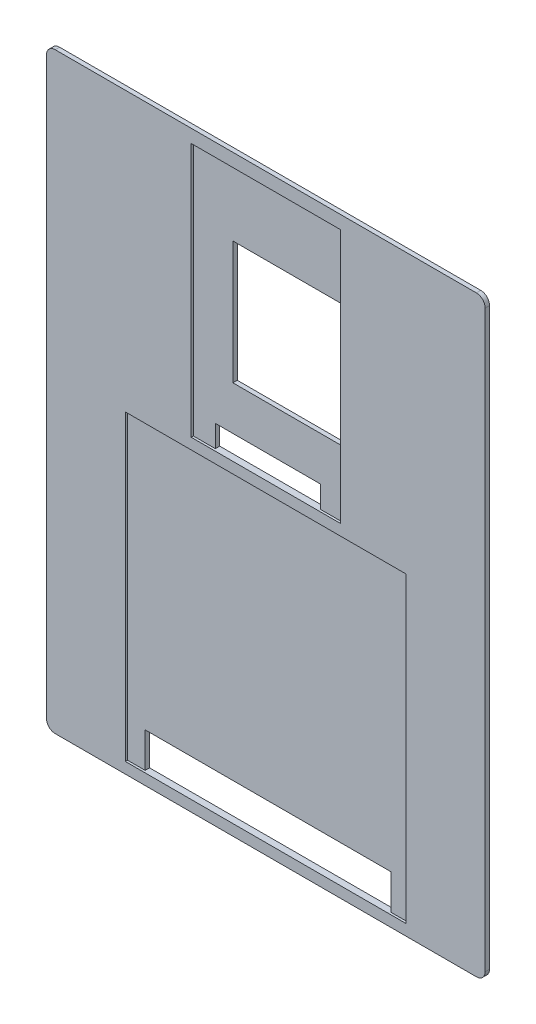
ISO-10303-21;
HEADER;
FILE_DESCRIPTION(('STEP AP214'),'2;1');
FILE_NAME('part.step','',(''),(''),'','','');
FILE_SCHEMA(('AUTOMOTIVE_DESIGN { 1 0 10303 214 1 1 1 1 }'));
ENDSEC;
DATA;
#1=APPLICATION_CONTEXT('core data for automotive mechanical design processes');
#2=APPLICATION_PROTOCOL_DEFINITION('international standard','automotive_design',2000,#1);
#3=PRODUCT_CONTEXT('',#1,'mechanical');
#4=PRODUCT('Part','Part','',(#3));
#5=PRODUCT_RELATED_PRODUCT_CATEGORY('part','',(#4));
#6=PRODUCT_DEFINITION_FORMATION('','',#4);
#7=PRODUCT_DEFINITION_CONTEXT('part definition',#1,'design');
#8=PRODUCT_DEFINITION('design','',#6,#7);
#9=PRODUCT_DEFINITION_SHAPE('','',#8);
#10=(LENGTH_UNIT() NAMED_UNIT(*) SI_UNIT(.MILLI.,.METRE.));
#11=(NAMED_UNIT(*) PLANE_ANGLE_UNIT() SI_UNIT($,.RADIAN.));
#12=(NAMED_UNIT(*) SI_UNIT($,.STERADIAN.) SOLID_ANGLE_UNIT());
#13=UNCERTAINTY_MEASURE_WITH_UNIT(LENGTH_MEASURE(1.E-05),#10,'distance_accuracy_value','');
#14=(GEOMETRIC_REPRESENTATION_CONTEXT(3) GLOBAL_UNCERTAINTY_ASSIGNED_CONTEXT((#13)) GLOBAL_UNIT_ASSIGNED_CONTEXT((#10,
#11,#12)) REPRESENTATION_CONTEXT('',''));
#15=CARTESIAN_POINT('',(0.,0.,0.));
#16=DIRECTION('',(0.,0.,1.));
#17=DIRECTION('',(1.,0.,0.));
#18=AXIS2_PLACEMENT_3D('',#15,#16,#17);
#19=CARTESIAN_POINT('',(-50.,0.,1.5));
#20=DIRECTION('',(1.,0.,0.));
#21=DIRECTION('',(0.,1.,0.));
#22=AXIS2_PLACEMENT_3D('',#19,#20,#21);
#23=PLANE('',#22);
#24=DIRECTION('',(0.,1.,0.));
#25=VECTOR('',#24,1.);
#26=CARTESIAN_POINT('',(-50.,0.,0.5));
#27=LINE('',#26,#25);
#28=CARTESIAN_POINT('',(-50.,-65.5,0.5));
#29=VERTEX_POINT('',#28);
#30=CARTESIAN_POINT('',(-50.,65.5,0.5));
#31=VERTEX_POINT('',#30);
#32=EDGE_CURVE('E269',#29,#31,#27,.T.);
#33=ORIENTED_EDGE('',*,*,#32,.F.);
#34=DIRECTION('',(0.,0.,-1.));
#35=VECTOR('',#34,1.);
#36=CARTESIAN_POINT('',(-50.,-65.5,1.5));
#37=LINE('',#36,#35);
#38=CARTESIAN_POINT('',(-50.,-65.5,1.5));
#39=VERTEX_POINT('',#38);
#40=EDGE_CURVE('E281',#29,#39,#37,.F.);
#41=ORIENTED_EDGE('',*,*,#40,.T.);
#42=DIRECTION('',(0.,-1.,0.));
#43=VECTOR('',#42,1.);
#44=CARTESIAN_POINT('',(-50.,0.,1.5));
#45=LINE('',#44,#43);
#46=CARTESIAN_POINT('',(-50.,65.5,1.5));
#47=VERTEX_POINT('',#46);
#48=EDGE_CURVE('E493',#47,#39,#45,.T.);
#49=ORIENTED_EDGE('',*,*,#48,.F.);
#50=DIRECTION('',(0.,0.,-1.));
#51=VECTOR('',#50,1.);
#52=CARTESIAN_POINT('',(-50.,65.5,0.));
#53=LINE('',#52,#51);
#54=EDGE_CURVE('E284',#47,#31,#53,.T.);
#55=ORIENTED_EDGE('',*,*,#54,.T.);
#56=EDGE_LOOP('',(#33,#41,#49,#55));
#57=FACE_BOUND('',#56,.T.);
#58=ADVANCED_FACE('F34',(#57),#23,.F.);
#59=CARTESIAN_POINT('',(0.,-67.5,1.5));
#60=DIRECTION('',(0.,1.,0.));
#61=DIRECTION('',(-1.,0.,0.));
#62=AXIS2_PLACEMENT_3D('',#59,#60,#61);
#63=PLANE('',#62);
#64=DIRECTION('',(-1.,0.,0.));
#65=VECTOR('',#64,1.);
#66=CARTESIAN_POINT('',(0.,-67.5,0.5));
#67=LINE('',#66,#65);
#68=CARTESIAN_POINT('',(48.,-67.5,0.5));
#69=VERTEX_POINT('',#68);
#70=CARTESIAN_POINT('',(-48.,-67.5,0.5));
#71=VERTEX_POINT('',#70);
#72=EDGE_CURVE('E272',#69,#71,#67,.T.);
#73=ORIENTED_EDGE('',*,*,#72,.F.);
#74=DIRECTION('',(0.,0.,-1.));
#75=VECTOR('',#74,1.);
#76=CARTESIAN_POINT('',(48.,-67.5,1.5));
#77=LINE('',#76,#75);
#78=CARTESIAN_POINT('',(48.,-67.5,1.5));
#79=VERTEX_POINT('',#78);
#80=EDGE_CURVE('E299',#69,#79,#77,.F.);
#81=ORIENTED_EDGE('',*,*,#80,.T.);
#82=DIRECTION('',(1.,0.,0.));
#83=VECTOR('',#82,1.);
#84=CARTESIAN_POINT('',(0.,-67.5,1.5));
#85=LINE('',#84,#83);
#86=CARTESIAN_POINT('',(-48.,-67.5,1.5));
#87=VERTEX_POINT('',#86);
#88=EDGE_CURVE('E495',#87,#79,#85,.T.);
#89=ORIENTED_EDGE('',*,*,#88,.F.);
#90=DIRECTION('',(0.,0.,-1.));
#91=VECTOR('',#90,1.);
#92=CARTESIAN_POINT('',(-48.,-67.5,1.5));
#93=LINE('',#92,#91);
#94=EDGE_CURVE('E292',#87,#71,#93,.T.);
#95=ORIENTED_EDGE('',*,*,#94,.T.);
#96=EDGE_LOOP('',(#73,#81,#89,#95));
#97=FACE_BOUND('',#96,.T.);
#98=ADVANCED_FACE('F596',(#97),#63,.F.);
#99=CARTESIAN_POINT('',(50.,0.,1.5));
#100=DIRECTION('',(1.,0.,0.));
#101=DIRECTION('',(0.,1.,0.));
#102=AXIS2_PLACEMENT_3D('',#99,#100,#101);
#103=PLANE('',#102);
#104=DIRECTION('',(0.,0.,-1.));
#105=VECTOR('',#104,1.);
#106=CARTESIAN_POINT('',(50.,-65.5,0.));
#107=LINE('',#106,#105);
#108=CARTESIAN_POINT('',(50.,-65.5,1.5));
#109=VERTEX_POINT('',#108);
#110=CARTESIAN_POINT('',(50.,-65.5,0.5));
#111=VERTEX_POINT('',#110);
#112=EDGE_CURVE('E539',#109,#111,#107,.T.);
#113=ORIENTED_EDGE('',*,*,#112,.T.);
#114=DIRECTION('',(0.,-1.,0.));
#115=VECTOR('',#114,1.);
#116=CARTESIAN_POINT('',(50.,0.,0.5));
#117=LINE('',#116,#115);
#118=CARTESIAN_POINT('',(50.,65.5,0.5));
#119=VERTEX_POINT('',#118);
#120=EDGE_CURVE('E561',#119,#111,#117,.T.);
#121=ORIENTED_EDGE('',*,*,#120,.F.);
#122=DIRECTION('',(0.,0.,-1.));
#123=VECTOR('',#122,1.);
#124=CARTESIAN_POINT('',(50.,65.5,1.5));
#125=LINE('',#124,#123);
#126=CARTESIAN_POINT('',(50.,65.5,1.5));
#127=VERTEX_POINT('',#126);
#128=EDGE_CURVE('E542',#119,#127,#125,.F.);
#129=ORIENTED_EDGE('',*,*,#128,.T.);
#130=DIRECTION('',(0.,-1.,0.));
#131=VECTOR('',#130,1.);
#132=CARTESIAN_POINT('',(50.,0.,1.5));
#133=LINE('',#132,#131);
#134=EDGE_CURVE('E498',#127,#109,#133,.T.);
#135=ORIENTED_EDGE('',*,*,#134,.T.);
#136=EDGE_LOOP('',(#113,#121,#129,#135));
#137=FACE_BOUND('',#136,.T.);
#138=ADVANCED_FACE('F601',(#137),#103,.T.);
#139=CARTESIAN_POINT('',(0.,67.5,1.5));
#140=DIRECTION('',(0.,1.,0.));
#141=DIRECTION('',(-1.,0.,0.));
#142=AXIS2_PLACEMENT_3D('',#139,#140,#141);
#143=PLANE('',#142);
#144=DIRECTION('',(0.,0.,-1.));
#145=VECTOR('',#144,1.);
#146=CARTESIAN_POINT('',(48.,67.5,1.5));
#147=LINE('',#146,#145);
#148=CARTESIAN_POINT('',(48.,67.5,1.5));
#149=VERTEX_POINT('',#148);
#150=CARTESIAN_POINT('',(48.,67.5,0.5));
#151=VERTEX_POINT('',#150);
#152=EDGE_CURVE('E536',#149,#151,#147,.T.);
#153=ORIENTED_EDGE('',*,*,#152,.T.);
#154=DIRECTION('',(1.,0.,0.));
#155=VECTOR('',#154,1.);
#156=CARTESIAN_POINT('',(0.,67.5,0.5));
#157=LINE('',#156,#155);
#158=CARTESIAN_POINT('',(-48.,67.5,0.5));
#159=VERTEX_POINT('',#158);
#160=EDGE_CURVE('E555',#159,#151,#157,.T.);
#161=ORIENTED_EDGE('',*,*,#160,.F.);
#162=DIRECTION('',(0.,0.,-1.));
#163=VECTOR('',#162,1.);
#164=CARTESIAN_POINT('',(-48.,67.5,1.5));
#165=LINE('',#164,#163);
#166=CARTESIAN_POINT('',(-48.,67.5,1.5));
#167=VERTEX_POINT('',#166);
#168=EDGE_CURVE('E524',#159,#167,#165,.F.);
#169=ORIENTED_EDGE('',*,*,#168,.T.);
#170=DIRECTION('',(1.,0.,0.));
#171=VECTOR('',#170,1.);
#172=CARTESIAN_POINT('',(0.,67.5,1.5));
#173=LINE('',#172,#171);
#174=EDGE_CURVE('E501',#167,#149,#173,.T.);
#175=ORIENTED_EDGE('',*,*,#174,.T.);
#176=EDGE_LOOP('',(#153,#161,#169,#175));
#177=FACE_BOUND('',#176,.T.);
#178=ADVANCED_FACE('F641',(#177),#143,.T.);
#179=CARTESIAN_POINT('',(48.,65.5,1.5));
#180=DIRECTION('',(0.,0.,-1.));
#181=DIRECTION('',(-1.,0.,0.));
#182=AXIS2_PLACEMENT_3D('',#179,#180,#181);
#183=CYLINDRICAL_SURFACE('',#182,2.);
#184=ORIENTED_EDGE('',*,*,#128,.F.);
#185=CARTESIAN_POINT('',(48.,65.5,0.5));
#186=DIRECTION('',(0.,0.,-1.));
#187=DIRECTION('',(-1.,0.,0.));
#188=AXIS2_PLACEMENT_3D('',#185,#186,#187);
#189=CIRCLE('',#188,2.);
#190=EDGE_CURVE('E557',#151,#119,#189,.T.);
#191=ORIENTED_EDGE('',*,*,#190,.F.);
#192=ORIENTED_EDGE('',*,*,#152,.F.);
#193=CARTESIAN_POINT('',(48.,65.5,1.5));
#194=DIRECTION('',(0.,0.,1.));
#195=DIRECTION('',(1.,0.,0.));
#196=AXIS2_PLACEMENT_3D('',#193,#194,#195);
#197=CIRCLE('',#196,2.);
#198=EDGE_CURVE('E290',#127,#149,#197,.T.);
#199=ORIENTED_EDGE('',*,*,#198,.F.);
#200=EDGE_LOOP('',(#184,#191,#192,#199));
#201=FACE_BOUND('',#200,.T.);
#202=ADVANCED_FACE('F638',(#201),#183,.T.);
#203=CARTESIAN_POINT('',(-48.,65.5,1.5));
#204=DIRECTION('',(0.,0.,1.));
#205=DIRECTION('',(1.,0.,0.));
#206=AXIS2_PLACEMENT_3D('',#203,#204,#205);
#207=CYLINDRICAL_SURFACE('',#206,2.);
#208=ORIENTED_EDGE('',*,*,#168,.F.);
#209=CARTESIAN_POINT('',(-48.,65.5,0.5));
#210=DIRECTION('',(0.,0.,-1.));
#211=DIRECTION('',(-1.,0.,0.));
#212=AXIS2_PLACEMENT_3D('',#209,#210,#211);
#213=CIRCLE('',#212,2.);
#214=EDGE_CURVE('E285',#31,#159,#213,.T.);
#215=ORIENTED_EDGE('',*,*,#214,.F.);
#216=ORIENTED_EDGE('',*,*,#54,.F.);
#217=CARTESIAN_POINT('',(-48.,65.5,1.5));
#218=DIRECTION('',(0.,0.,1.));
#219=DIRECTION('',(1.,0.,0.));
#220=AXIS2_PLACEMENT_3D('',#217,#218,#219);
#221=CIRCLE('',#220,2.);
#222=EDGE_CURVE('E294',#167,#47,#221,.T.);
#223=ORIENTED_EDGE('',*,*,#222,.F.);
#224=EDGE_LOOP('',(#208,#215,#216,#223));
#225=FACE_BOUND('',#224,.T.);
#226=ADVANCED_FACE('F553',(#225),#207,.T.);
#227=CARTESIAN_POINT('',(48.,-65.5,1.5));
#228=DIRECTION('',(0.,0.,1.));
#229=DIRECTION('',(1.,0.,0.));
#230=AXIS2_PLACEMENT_3D('',#227,#228,#229);
#231=CYLINDRICAL_SURFACE('',#230,2.);
#232=ORIENTED_EDGE('',*,*,#80,.F.);
#233=CARTESIAN_POINT('',(48.,-65.5,0.5));
#234=DIRECTION('',(0.,0.,-1.));
#235=DIRECTION('',(-1.,0.,0.));
#236=AXIS2_PLACEMENT_3D('',#233,#234,#235);
#237=CIRCLE('',#236,2.);
#238=EDGE_CURVE('E398',#111,#69,#237,.T.);
#239=ORIENTED_EDGE('',*,*,#238,.F.);
#240=ORIENTED_EDGE('',*,*,#112,.F.);
#241=CARTESIAN_POINT('',(48.,-65.5,1.5));
#242=DIRECTION('',(0.,0.,1.));
#243=DIRECTION('',(1.,0.,0.));
#244=AXIS2_PLACEMENT_3D('',#241,#242,#243);
#245=CIRCLE('',#244,2.);
#246=EDGE_CURVE('E545',#79,#109,#245,.T.);
#247=ORIENTED_EDGE('',*,*,#246,.F.);
#248=EDGE_LOOP('',(#232,#239,#240,#247));
#249=FACE_BOUND('',#248,.T.);
#250=ADVANCED_FACE('F645',(#249),#231,.T.);
#251=CARTESIAN_POINT('',(-48.,-65.5,1.5));
#252=DIRECTION('',(0.,0.,-1.));
#253=DIRECTION('',(-1.,0.,0.));
#254=AXIS2_PLACEMENT_3D('',#251,#252,#253);
#255=CYLINDRICAL_SURFACE('',#254,2.);
#256=ORIENTED_EDGE('',*,*,#40,.F.);
#257=CARTESIAN_POINT('',(-48.,-65.5,0.5));
#258=DIRECTION('',(0.,0.,-1.));
#259=DIRECTION('',(-1.,0.,0.));
#260=AXIS2_PLACEMENT_3D('',#257,#258,#259);
#261=CIRCLE('',#260,2.);
#262=EDGE_CURVE('E266',#71,#29,#261,.T.);
#263=ORIENTED_EDGE('',*,*,#262,.F.);
#264=ORIENTED_EDGE('',*,*,#94,.F.);
#265=CARTESIAN_POINT('',(-48.,-65.5,1.5));
#266=DIRECTION('',(0.,0.,1.));
#267=DIRECTION('',(1.,0.,0.));
#268=AXIS2_PLACEMENT_3D('',#265,#266,#267);
#269=CIRCLE('',#268,2.);
#270=EDGE_CURVE('E289',#39,#87,#269,.T.);
#271=ORIENTED_EDGE('',*,*,#270,.F.);
#272=EDGE_LOOP('',(#256,#263,#264,#271));
#273=FACE_BOUND('',#272,.T.);
#274=ADVANCED_FACE('F288',(#273),#255,.T.);
#275=CARTESIAN_POINT('',(0.,6.50000000000003,1.5));
#276=DIRECTION('',(0.,1.,0.));
#277=DIRECTION('',(0.,0.,1.));
#278=AXIS2_PLACEMENT_3D('',#275,#276,#277);
#279=PLANE('',#278);
#280=DIRECTION('',(1.,0.,0.));
#281=VECTOR('',#280,1.);
#282=CARTESIAN_POINT('',(0.,6.50000000000003,0.));
#283=LINE('',#282,#281);
#284=CARTESIAN_POINT('',(-12.,6.50000000000003,0.));
#285=VERTEX_POINT('',#284);
#286=CARTESIAN_POINT('',(12.,6.50000000000003,0.));
#287=VERTEX_POINT('',#286);
#288=EDGE_CURVE('E475',#285,#287,#283,.T.);
#289=ORIENTED_EDGE('',*,*,#288,.F.);
#290=DIRECTION('',(0.,0.,-1.));
#291=VECTOR('',#290,1.);
#292=CARTESIAN_POINT('',(-12.,6.50000000000003,1.));
#293=LINE('',#292,#291);
#294=CARTESIAN_POINT('',(-12.,6.50000000000003,1.));
#295=VERTEX_POINT('',#294);
#296=EDGE_CURVE('E412',#295,#285,#293,.T.);
#297=ORIENTED_EDGE('',*,*,#296,.F.);
#298=DIRECTION('',(1.,0.,0.));
#299=VECTOR('',#298,1.);
#300=CARTESIAN_POINT('',(0.,6.50000000000003,1.));
#301=LINE('',#300,#299);
#302=CARTESIAN_POINT('',(-17.,6.50000000000003,1.));
#303=VERTEX_POINT('',#302);
#304=EDGE_CURVE('E375',#303,#295,#301,.T.);
#305=ORIENTED_EDGE('',*,*,#304,.F.);
#306=DIRECTION('',(0.,0.,-1.));
#307=VECTOR('',#306,1.);
#308=CARTESIAN_POINT('',(-17.,6.50000000000003,1.5));
#309=LINE('',#308,#307);
#310=CARTESIAN_POINT('',(-17.,6.50000000000003,1.5));
#311=VERTEX_POINT('',#310);
#312=EDGE_CURVE('E511',#311,#303,#309,.T.);
#313=ORIENTED_EDGE('',*,*,#312,.F.);
#314=DIRECTION('',(1.,0.,0.));
#315=VECTOR('',#314,1.);
#316=CARTESIAN_POINT('',(0.,6.50000000000003,1.5));
#317=LINE('',#316,#315);
#318=CARTESIAN_POINT('',(17.,6.50000000000003,1.5));
#319=VERTEX_POINT('',#318);
#320=EDGE_CURVE('E490',#311,#319,#317,.T.);
#321=ORIENTED_EDGE('',*,*,#320,.T.);
#322=DIRECTION('',(0.,0.,-1.));
#323=VECTOR('',#322,1.);
#324=CARTESIAN_POINT('',(17.,6.50000000000003,1.5));
#325=LINE('',#324,#323);
#326=CARTESIAN_POINT('',(17.,6.50000000000003,1.));
#327=VERTEX_POINT('',#326);
#328=EDGE_CURVE('E514',#319,#327,#325,.T.);
#329=ORIENTED_EDGE('',*,*,#328,.T.);
#330=CARTESIAN_POINT('',(12.,6.50000000000003,1.));
#331=VERTEX_POINT('',#330);
#332=EDGE_CURVE('E371',#331,#327,#301,.T.);
#333=ORIENTED_EDGE('',*,*,#332,.F.);
#334=DIRECTION('',(0.,0.,-1.));
#335=VECTOR('',#334,1.);
#336=CARTESIAN_POINT('',(12.,6.50000000000003,1.));
#337=LINE('',#336,#335);
#338=EDGE_CURVE('E425',#331,#287,#337,.T.);
#339=ORIENTED_EDGE('',*,*,#338,.T.);
#340=EDGE_LOOP('',(#289,#297,#305,#313,#321,#329,#333,#339));
#341=FACE_BOUND('',#340,.T.);
#342=ADVANCED_FACE('F606',(#341),#279,.T.);
#343=CARTESIAN_POINT('',(-17.,0.,1.5));
#344=DIRECTION('',(1.,0.,0.));
#345=DIRECTION('',(0.,1.,0.));
#346=AXIS2_PLACEMENT_3D('',#343,#344,#345);
#347=PLANE('',#346);
#348=DIRECTION('',(0.,-1.,0.));
#349=VECTOR('',#348,1.);
#350=CARTESIAN_POINT('',(-17.,0.,1.));
#351=LINE('',#350,#349);
#352=CARTESIAN_POINT('',(-17.,64.5,1.));
#353=VERTEX_POINT('',#352);
#354=EDGE_CURVE('E392',#353,#303,#351,.T.);
#355=ORIENTED_EDGE('',*,*,#354,.F.);
#356=DIRECTION('',(0.,0.,-1.));
#357=VECTOR('',#356,1.);
#358=CARTESIAN_POINT('',(-17.,64.5,1.5));
#359=LINE('',#358,#357);
#360=CARTESIAN_POINT('',(-17.,64.5,1.5));
#361=VERTEX_POINT('',#360);
#362=EDGE_CURVE('E521',#361,#353,#359,.T.);
#363=ORIENTED_EDGE('',*,*,#362,.F.);
#364=DIRECTION('',(0.,-1.,0.));
#365=VECTOR('',#364,1.);
#366=CARTESIAN_POINT('',(-17.,0.,1.5));
#367=LINE('',#366,#365);
#368=EDGE_CURVE('E482',#361,#311,#367,.T.);
#369=ORIENTED_EDGE('',*,*,#368,.T.);
#370=ORIENTED_EDGE('',*,*,#312,.T.);
#371=EDGE_LOOP('',(#355,#363,#369,#370));
#372=FACE_BOUND('',#371,.T.);
#373=ADVANCED_FACE('F609',(#372),#347,.T.);
#374=CARTESIAN_POINT('',(0.,64.5,1.5));
#375=DIRECTION('',(0.,1.,0.));
#376=DIRECTION('',(0.,0.,1.));
#377=AXIS2_PLACEMENT_3D('',#374,#375,#376);
#378=PLANE('',#377);
#379=ORIENTED_EDGE('',*,*,#362,.T.);
#380=DIRECTION('',(1.,0.,0.));
#381=VECTOR('',#380,1.);
#382=CARTESIAN_POINT('',(0.,64.5,1.));
#383=LINE('',#382,#381);
#384=CARTESIAN_POINT('',(17.,64.5,1.));
#385=VERTEX_POINT('',#384);
#386=EDGE_CURVE('E389',#353,#385,#383,.T.);
#387=ORIENTED_EDGE('',*,*,#386,.T.);
#388=DIRECTION('',(0.,0.,-1.));
#389=VECTOR('',#388,1.);
#390=CARTESIAN_POINT('',(17.,64.5,1.5));
#391=LINE('',#390,#389);
#392=CARTESIAN_POINT('',(17.,64.5,1.5));
#393=VERTEX_POINT('',#392);
#394=EDGE_CURVE('E518',#393,#385,#391,.T.);
#395=ORIENTED_EDGE('',*,*,#394,.F.);
#396=DIRECTION('',(1.,0.,0.));
#397=VECTOR('',#396,1.);
#398=CARTESIAN_POINT('',(0.,64.5,1.5));
#399=LINE('',#398,#397);
#400=EDGE_CURVE('E485',#361,#393,#399,.T.);
#401=ORIENTED_EDGE('',*,*,#400,.F.);
#402=EDGE_LOOP('',(#379,#387,#395,#401));
#403=FACE_BOUND('',#402,.T.);
#404=ADVANCED_FACE('F615',(#403),#378,.F.);
#405=CARTESIAN_POINT('',(17.,0.,1.5));
#406=DIRECTION('',(1.,0.,0.));
#407=DIRECTION('',(0.,1.,0.));
#408=AXIS2_PLACEMENT_3D('',#405,#406,#407);
#409=PLANE('',#408);
#410=DIRECTION('',(0.,-1.,0.));
#411=VECTOR('',#410,1.);
#412=CARTESIAN_POINT('',(17.,0.,1.));
#413=LINE('',#412,#411);
#414=CARTESIAN_POINT('',(17.,49.5,1.));
#415=VERTEX_POINT('',#414);
#416=EDGE_CURVE('E386',#385,#415,#413,.T.);
#417=ORIENTED_EDGE('',*,*,#416,.T.);
#418=DIRECTION('',(0.,0.,-1.));
#419=VECTOR('',#418,1.);
#420=CARTESIAN_POINT('',(17.,49.5,1.));
#421=LINE('',#420,#419);
#422=CARTESIAN_POINT('',(17.,49.5,0.));
#423=VERTEX_POINT('',#422);
#424=EDGE_CURVE('E415',#415,#423,#421,.T.);
#425=ORIENTED_EDGE('',*,*,#424,.T.);
#426=DIRECTION('',(0.,-1.,0.));
#427=VECTOR('',#426,1.);
#428=CARTESIAN_POINT('',(17.,0.,0.));
#429=LINE('',#428,#427);
#430=CARTESIAN_POINT('',(17.,21.5,0.));
#431=VERTEX_POINT('',#430);
#432=EDGE_CURVE('E507',#423,#431,#429,.T.);
#433=ORIENTED_EDGE('',*,*,#432,.T.);
#434=DIRECTION('',(0.,0.,-1.));
#435=VECTOR('',#434,1.);
#436=CARTESIAN_POINT('',(17.,21.5,1.));
#437=LINE('',#436,#435);
#438=CARTESIAN_POINT('',(17.,21.5,1.));
#439=VERTEX_POINT('',#438);
#440=EDGE_CURVE('E422',#439,#431,#437,.T.);
#441=ORIENTED_EDGE('',*,*,#440,.F.);
#442=DIRECTION('',(0.,-1.,0.));
#443=VECTOR('',#442,1.);
#444=CARTESIAN_POINT('',(17.,0.,1.));
#445=LINE('',#444,#443);
#446=EDGE_CURVE('E374',#439,#327,#445,.T.);
#447=ORIENTED_EDGE('',*,*,#446,.T.);
#448=ORIENTED_EDGE('',*,*,#328,.F.);
#449=DIRECTION('',(0.,-1.,0.));
#450=VECTOR('',#449,1.);
#451=CARTESIAN_POINT('',(17.,0.,1.5));
#452=LINE('',#451,#450);
#453=EDGE_CURVE('E488',#393,#319,#452,.T.);
#454=ORIENTED_EDGE('',*,*,#453,.F.);
#455=ORIENTED_EDGE('',*,*,#394,.T.);
#456=EDGE_LOOP('',(#417,#425,#433,#441,#447,#448,#454,#455));
#457=FACE_BOUND('',#456,.T.);
#458=ADVANCED_FACE('F611',(#457),#409,.F.);
#459=CARTESIAN_POINT('',(0.,-65.,1.5));
#460=DIRECTION('',(0.,1.,0.));
#461=DIRECTION('',(0.,0.,1.));
#462=AXIS2_PLACEMENT_3D('',#459,#460,#461);
#463=PLANE('',#462);
#464=DIRECTION('',(0.,0.,-1.));
#465=VECTOR('',#464,1.);
#466=CARTESIAN_POINT('',(-28.,-65.,1.));
#467=LINE('',#466,#465);
#468=CARTESIAN_POINT('',(-28.,-65.,1.));
#469=VERTEX_POINT('',#468);
#470=CARTESIAN_POINT('',(-28.,-65.,0.));
#471=VERTEX_POINT('',#470);
#472=EDGE_CURVE('E460',#469,#471,#467,.T.);
#473=ORIENTED_EDGE('',*,*,#472,.F.);
#474=DIRECTION('',(1.,0.,0.));
#475=VECTOR('',#474,1.);
#476=CARTESIAN_POINT('',(0.,-65.,1.));
#477=LINE('',#476,#475);
#478=CARTESIAN_POINT('',(-32.,-65.,1.));
#479=VERTEX_POINT('',#478);
#480=EDGE_CURVE('E446',#479,#469,#477,.T.);
#481=ORIENTED_EDGE('',*,*,#480,.F.);
#482=DIRECTION('',(0.,0.,-1.));
#483=VECTOR('',#482,1.);
#484=CARTESIAN_POINT('',(-32.,-65.,1.5));
#485=LINE('',#484,#483);
#486=CARTESIAN_POINT('',(-32.,-65.,1.5));
#487=VERTEX_POINT('',#486);
#488=EDGE_CURVE('E515',#487,#479,#485,.T.);
#489=ORIENTED_EDGE('',*,*,#488,.F.);
#490=DIRECTION('',(1.,0.,0.));
#491=VECTOR('',#490,1.);
#492=CARTESIAN_POINT('',(0.,-65.,1.5));
#493=LINE('',#492,#491);
#494=CARTESIAN_POINT('',(32.,-65.,1.5));
#495=VERTEX_POINT('',#494);
#496=EDGE_CURVE('E471',#487,#495,#493,.T.);
#497=ORIENTED_EDGE('',*,*,#496,.T.);
#498=DIRECTION('',(0.,0.,-1.));
#499=VECTOR('',#498,1.);
#500=CARTESIAN_POINT('',(32.,-65.,1.5));
#501=LINE('',#500,#499);
#502=CARTESIAN_POINT('',(32.,-65.,1.));
#503=VERTEX_POINT('',#502);
#504=EDGE_CURVE('E504',#495,#503,#501,.T.);
#505=ORIENTED_EDGE('',*,*,#504,.T.);
#506=CARTESIAN_POINT('',(28.,-65.,1.));
#507=VERTEX_POINT('',#506);
#508=EDGE_CURVE('E443',#507,#503,#477,.T.);
#509=ORIENTED_EDGE('',*,*,#508,.F.);
#510=DIRECTION('',(0.,0.,-1.));
#511=VECTOR('',#510,1.);
#512=CARTESIAN_POINT('',(28.,-65.,1.));
#513=LINE('',#512,#511);
#514=CARTESIAN_POINT('',(28.,-65.,0.));
#515=VERTEX_POINT('',#514);
#516=EDGE_CURVE('E463',#507,#515,#513,.T.);
#517=ORIENTED_EDGE('',*,*,#516,.T.);
#518=DIRECTION('',(1.,0.,0.));
#519=VECTOR('',#518,1.);
#520=CARTESIAN_POINT('',(0.,-65.,0.));
#521=LINE('',#520,#519);
#522=EDGE_CURVE('E470',#471,#515,#521,.T.);
#523=ORIENTED_EDGE('',*,*,#522,.F.);
#524=EDGE_LOOP('',(#473,#481,#489,#497,#505,#509,#517,#523));
#525=FACE_BOUND('',#524,.T.);
#526=ADVANCED_FACE('F614',(#525),#463,.T.);
#527=CARTESIAN_POINT('',(-32.,0.,1.5));
#528=DIRECTION('',(1.,0.,0.));
#529=DIRECTION('',(0.,1.,0.));
#530=AXIS2_PLACEMENT_3D('',#527,#528,#529);
#531=PLANE('',#530);
#532=DIRECTION('',(0.,-1.,0.));
#533=VECTOR('',#532,1.);
#534=CARTESIAN_POINT('',(-32.,0.,1.));
#535=LINE('',#534,#533);
#536=CARTESIAN_POINT('',(-32.,4.,1.));
#537=VERTEX_POINT('',#536);
#538=EDGE_CURVE('E452',#537,#479,#535,.T.);
#539=ORIENTED_EDGE('',*,*,#538,.F.);
#540=DIRECTION('',(0.,0.,-1.));
#541=VECTOR('',#540,1.);
#542=CARTESIAN_POINT('',(-32.,4.,1.5));
#543=LINE('',#542,#541);
#544=CARTESIAN_POINT('',(-32.,4.,1.5));
#545=VERTEX_POINT('',#544);
#546=EDGE_CURVE('E530',#545,#537,#543,.T.);
#547=ORIENTED_EDGE('',*,*,#546,.F.);
#548=DIRECTION('',(0.,-1.,0.));
#549=VECTOR('',#548,1.);
#550=CARTESIAN_POINT('',(-32.,0.,1.5));
#551=LINE('',#550,#549);
#552=EDGE_CURVE('E474',#545,#487,#551,.T.);
#553=ORIENTED_EDGE('',*,*,#552,.T.);
#554=ORIENTED_EDGE('',*,*,#488,.T.);
#555=EDGE_LOOP('',(#539,#547,#553,#554));
#556=FACE_BOUND('',#555,.T.);
#557=ADVANCED_FACE('F630',(#556),#531,.T.);
#558=CARTESIAN_POINT('',(0.,4.,1.5));
#559=DIRECTION('',(0.,1.,0.));
#560=DIRECTION('',(0.,0.,1.));
#561=AXIS2_PLACEMENT_3D('',#558,#559,#560);
#562=PLANE('',#561);
#563=ORIENTED_EDGE('',*,*,#546,.T.);
#564=DIRECTION('',(1.,0.,0.));
#565=VECTOR('',#564,1.);
#566=CARTESIAN_POINT('',(0.,4.,1.));
#567=LINE('',#566,#565);
#568=CARTESIAN_POINT('',(32.,4.,1.));
#569=VERTEX_POINT('',#568);
#570=EDGE_CURVE('E449',#537,#569,#567,.T.);
#571=ORIENTED_EDGE('',*,*,#570,.T.);
#572=DIRECTION('',(0.,0.,-1.));
#573=VECTOR('',#572,1.);
#574=CARTESIAN_POINT('',(32.,4.,1.5));
#575=LINE('',#574,#573);
#576=CARTESIAN_POINT('',(32.,4.,1.5));
#577=VERTEX_POINT('',#576);
#578=EDGE_CURVE('E527',#577,#569,#575,.T.);
#579=ORIENTED_EDGE('',*,*,#578,.F.);
#580=DIRECTION('',(1.,0.,0.));
#581=VECTOR('',#580,1.);
#582=CARTESIAN_POINT('',(0.,4.,1.5));
#583=LINE('',#582,#581);
#584=EDGE_CURVE('E478',#545,#577,#583,.T.);
#585=ORIENTED_EDGE('',*,*,#584,.F.);
#586=EDGE_LOOP('',(#563,#571,#579,#585));
#587=FACE_BOUND('',#586,.T.);
#588=ADVANCED_FACE('F626',(#587),#562,.F.);
#589=CARTESIAN_POINT('',(32.,0.,1.5));
#590=DIRECTION('',(1.,0.,0.));
#591=DIRECTION('',(0.,1.,0.));
#592=AXIS2_PLACEMENT_3D('',#589,#590,#591);
#593=PLANE('',#592);
#594=ORIENTED_EDGE('',*,*,#578,.T.);
#595=DIRECTION('',(0.,-1.,0.));
#596=VECTOR('',#595,1.);
#597=CARTESIAN_POINT('',(32.,0.,1.));
#598=LINE('',#597,#596);
#599=EDGE_CURVE('E445',#569,#503,#598,.T.);
#600=ORIENTED_EDGE('',*,*,#599,.T.);
#601=ORIENTED_EDGE('',*,*,#504,.F.);
#602=DIRECTION('',(0.,-1.,0.));
#603=VECTOR('',#602,1.);
#604=CARTESIAN_POINT('',(32.,0.,1.5));
#605=LINE('',#604,#603);
#606=EDGE_CURVE('E480',#577,#495,#605,.T.);
#607=ORIENTED_EDGE('',*,*,#606,.F.);
#608=EDGE_LOOP('',(#594,#600,#601,#607));
#609=FACE_BOUND('',#608,.T.);
#610=ADVANCED_FACE('F623',(#609),#593,.F.);
#611=CARTESIAN_POINT('',(0.,0.,1.5));
#612=DIRECTION('',(0.,0.,1.));
#613=DIRECTION('',(1.,0.,0.));
#614=AXIS2_PLACEMENT_3D('',#611,#612,#613);
#615=PLANE('',#614);
#616=ORIENTED_EDGE('',*,*,#496,.F.);
#617=ORIENTED_EDGE('',*,*,#552,.F.);
#618=ORIENTED_EDGE('',*,*,#584,.T.);
#619=ORIENTED_EDGE('',*,*,#606,.T.);
#620=EDGE_LOOP('',(#616,#617,#618,#619));
#621=FACE_BOUND('',#620,.T.);
#622=ORIENTED_EDGE('',*,*,#368,.F.);
#623=ORIENTED_EDGE('',*,*,#400,.T.);
#624=ORIENTED_EDGE('',*,*,#453,.T.);
#625=ORIENTED_EDGE('',*,*,#320,.F.);
#626=EDGE_LOOP('',(#622,#623,#624,#625));
#627=FACE_BOUND('',#626,.T.);
#628=ORIENTED_EDGE('',*,*,#134,.F.);
#629=ORIENTED_EDGE('',*,*,#198,.T.);
#630=ORIENTED_EDGE('',*,*,#174,.F.);
#631=ORIENTED_EDGE('',*,*,#222,.T.);
#632=ORIENTED_EDGE('',*,*,#48,.T.);
#633=ORIENTED_EDGE('',*,*,#270,.T.);
#634=ORIENTED_EDGE('',*,*,#88,.T.);
#635=ORIENTED_EDGE('',*,*,#246,.T.);
#636=EDGE_LOOP('',(#628,#629,#630,#631,#632,#633,#634,#635));
#637=FACE_BOUND('',#636,.T.);
#638=ADVANCED_FACE('F550',(#621,#627,#637),#615,.T.);
#639=CARTESIAN_POINT('',(0.,0.,0.));
#640=DIRECTION('',(0.,0.,1.));
#641=DIRECTION('',(1.,0.,0.));
#642=AXIS2_PLACEMENT_3D('',#639,#640,#641);
#643=PLANE('',#642);
#644=DIRECTION('',(0.,-1.,0.));
#645=VECTOR('',#644,1.);
#646=CARTESIAN_POINT('',(49.,0.,0.));
#647=LINE('',#646,#645);
#648=CARTESIAN_POINT('',(49.,64.5,0.));
#649=VERTEX_POINT('',#648);
#650=CARTESIAN_POINT('',(49.,-64.5,0.));
#651=VERTEX_POINT('',#650);
#652=EDGE_CURVE('E356',#649,#651,#647,.T.);
#653=ORIENTED_EDGE('',*,*,#652,.T.);
#654=CARTESIAN_POINT('',(47.,-64.5,0.));
#655=DIRECTION('',(0.,0.,1.));
#656=DIRECTION('',(1.,0.,0.));
#657=AXIS2_PLACEMENT_3D('',#654,#655,#656);
#658=CIRCLE('',#657,2.);
#659=CARTESIAN_POINT('',(47.,-66.5,0.));
#660=VERTEX_POINT('',#659);
#661=EDGE_CURVE('E312',#651,#660,#658,.F.);
#662=ORIENTED_EDGE('',*,*,#661,.T.);
#663=DIRECTION('',(-1.,0.,0.));
#664=VECTOR('',#663,1.);
#665=CARTESIAN_POINT('',(0.,-66.5,0.));
#666=LINE('',#665,#664);
#667=CARTESIAN_POINT('',(-47.,-66.5,0.));
#668=VERTEX_POINT('',#667);
#669=EDGE_CURVE('E358',#660,#668,#666,.T.);
#670=ORIENTED_EDGE('',*,*,#669,.T.);
#671=CARTESIAN_POINT('',(-47.,-64.5,0.));
#672=DIRECTION('',(0.,0.,1.));
#673=DIRECTION('',(1.,0.,0.));
#674=AXIS2_PLACEMENT_3D('',#671,#672,#673);
#675=CIRCLE('',#674,2.);
#676=CARTESIAN_POINT('',(-49.,-64.5,0.));
#677=VERTEX_POINT('',#676);
#678=EDGE_CURVE('E310',#668,#677,#675,.F.);
#679=ORIENTED_EDGE('',*,*,#678,.T.);
#680=DIRECTION('',(0.,-1.,0.));
#681=VECTOR('',#680,1.);
#682=CARTESIAN_POINT('',(-49.,0.,0.));
#683=LINE('',#682,#681);
#684=CARTESIAN_POINT('',(-49.,64.5,0.));
#685=VERTEX_POINT('',#684);
#686=EDGE_CURVE('E353',#685,#677,#683,.T.);
#687=ORIENTED_EDGE('',*,*,#686,.F.);
#688=CARTESIAN_POINT('',(-47.,64.5,0.));
#689=DIRECTION('',(0.,0.,1.));
#690=DIRECTION('',(1.,0.,0.));
#691=AXIS2_PLACEMENT_3D('',#688,#689,#690);
#692=CIRCLE('',#691,2.);
#693=CARTESIAN_POINT('',(-47.,66.5,0.));
#694=VERTEX_POINT('',#693);
#695=EDGE_CURVE('E308',#685,#694,#692,.F.);
#696=ORIENTED_EDGE('',*,*,#695,.T.);
#697=DIRECTION('',(-1.,0.,0.));
#698=VECTOR('',#697,1.);
#699=CARTESIAN_POINT('',(0.,66.5,0.));
#700=LINE('',#699,#698);
#701=CARTESIAN_POINT('',(47.,66.5,0.));
#702=VERTEX_POINT('',#701);
#703=EDGE_CURVE('E345',#702,#694,#700,.T.);
#704=ORIENTED_EDGE('',*,*,#703,.F.);
#705=CARTESIAN_POINT('',(47.,64.5,0.));
#706=DIRECTION('',(0.,0.,1.));
#707=DIRECTION('',(1.,0.,0.));
#708=AXIS2_PLACEMENT_3D('',#705,#706,#707);
#709=CIRCLE('',#708,2.);
#710=EDGE_CURVE('E306',#702,#649,#709,.F.);
#711=ORIENTED_EDGE('',*,*,#710,.T.);
#712=EDGE_LOOP('',(#653,#662,#670,#679,#687,#696,#704,#711));
#713=FACE_BOUND('',#712,.T.);
#714=ORIENTED_EDGE('',*,*,#288,.T.);
#715=DIRECTION('',(0.,1.,0.));
#716=VECTOR('',#715,1.);
#717=CARTESIAN_POINT('',(12.,0.,0.));
#718=LINE('',#717,#716);
#719=CARTESIAN_POINT('',(12.,11.5,0.));
#720=VERTEX_POINT('',#719);
#721=EDGE_CURVE('E401',#287,#720,#718,.T.);
#722=ORIENTED_EDGE('',*,*,#721,.T.);
#723=DIRECTION('',(1.,0.,0.));
#724=VECTOR('',#723,1.);
#725=CARTESIAN_POINT('',(0.,11.5,0.));
#726=LINE('',#725,#724);
#727=CARTESIAN_POINT('',(-12.,11.5,0.));
#728=VERTEX_POINT('',#727);
#729=EDGE_CURVE('E397',#728,#720,#726,.T.);
#730=ORIENTED_EDGE('',*,*,#729,.F.);
#731=DIRECTION('',(0.,1.,0.));
#732=VECTOR('',#731,1.);
#733=CARTESIAN_POINT('',(-12.,0.,0.));
#734=LINE('',#733,#732);
#735=EDGE_CURVE('E394',#285,#728,#734,.T.);
#736=ORIENTED_EDGE('',*,*,#735,.F.);
#737=EDGE_LOOP('',(#714,#722,#730,#736));
#738=FACE_BOUND('',#737,.T.);
#739=ORIENTED_EDGE('',*,*,#432,.F.);
#740=DIRECTION('',(-1.,0.,0.));
#741=VECTOR('',#740,1.);
#742=CARTESIAN_POINT('',(0.,49.5,0.));
#743=LINE('',#742,#741);
#744=CARTESIAN_POINT('',(-7.99999999999999,49.5,0.));
#745=VERTEX_POINT('',#744);
#746=EDGE_CURVE('E366',#423,#745,#743,.T.);
#747=ORIENTED_EDGE('',*,*,#746,.T.);
#748=DIRECTION('',(0.,-1.,0.));
#749=VECTOR('',#748,1.);
#750=CARTESIAN_POINT('',(-7.99999999999998,0.,0.));
#751=LINE('',#750,#749);
#752=CARTESIAN_POINT('',(-7.99999999999999,21.5,0.));
#753=VERTEX_POINT('',#752);
#754=EDGE_CURVE('E407',#745,#753,#751,.T.);
#755=ORIENTED_EDGE('',*,*,#754,.T.);
#756=DIRECTION('',(1.,0.,0.));
#757=VECTOR('',#756,1.);
#758=CARTESIAN_POINT('',(0.,21.5,0.));
#759=LINE('',#758,#757);
#760=EDGE_CURVE('E404',#753,#431,#759,.T.);
#761=ORIENTED_EDGE('',*,*,#760,.T.);
#762=EDGE_LOOP('',(#739,#747,#755,#761));
#763=FACE_BOUND('',#762,.T.);
#764=ORIENTED_EDGE('',*,*,#522,.T.);
#765=DIRECTION('',(0.,1.,0.));
#766=VECTOR('',#765,1.);
#767=CARTESIAN_POINT('',(28.,0.,0.));
#768=LINE('',#767,#766);
#769=CARTESIAN_POINT('',(28.,-57.,0.));
#770=VERTEX_POINT('',#769);
#771=EDGE_CURVE('E437',#515,#770,#768,.T.);
#772=ORIENTED_EDGE('',*,*,#771,.T.);
#773=DIRECTION('',(-1.,0.,0.));
#774=VECTOR('',#773,1.);
#775=CARTESIAN_POINT('',(0.,-57.,0.));
#776=LINE('',#775,#774);
#777=CARTESIAN_POINT('',(-28.,-57.,0.));
#778=VERTEX_POINT('',#777);
#779=EDGE_CURVE('E455',#770,#778,#776,.T.);
#780=ORIENTED_EDGE('',*,*,#779,.T.);
#781=DIRECTION('',(0.,-1.,0.));
#782=VECTOR('',#781,1.);
#783=CARTESIAN_POINT('',(-28.,0.,0.));
#784=LINE('',#783,#782);
#785=EDGE_CURVE('E432',#778,#471,#784,.T.);
#786=ORIENTED_EDGE('',*,*,#785,.T.);
#787=EDGE_LOOP('',(#764,#772,#780,#786));
#788=FACE_BOUND('',#787,.T.);
#789=ADVANCED_FACE('F351',(#713,#738,#763,#788),#643,.F.);
#790=CARTESIAN_POINT('',(-28.,0.,1.));
#791=DIRECTION('',(1.,0.,0.));
#792=DIRECTION('',(0.,0.,-1.));
#793=AXIS2_PLACEMENT_3D('',#790,#791,#792);
#794=PLANE('',#793);
#795=ORIENTED_EDGE('',*,*,#785,.F.);
#796=DIRECTION('',(0.,0.,-1.));
#797=VECTOR('',#796,1.);
#798=CARTESIAN_POINT('',(-28.,-57.,1.));
#799=LINE('',#798,#797);
#800=CARTESIAN_POINT('',(-28.,-57.,1.));
#801=VERTEX_POINT('',#800);
#802=EDGE_CURVE('E468',#801,#778,#799,.T.);
#803=ORIENTED_EDGE('',*,*,#802,.F.);
#804=DIRECTION('',(0.,-1.,0.));
#805=VECTOR('',#804,1.);
#806=CARTESIAN_POINT('',(-28.,0.,1.));
#807=LINE('',#806,#805);
#808=EDGE_CURVE('E433',#801,#469,#807,.T.);
#809=ORIENTED_EDGE('',*,*,#808,.T.);
#810=ORIENTED_EDGE('',*,*,#472,.T.);
#811=EDGE_LOOP('',(#795,#803,#809,#810));
#812=FACE_BOUND('',#811,.T.);
#813=ADVANCED_FACE('F701',(#812),#794,.T.);
#814=CARTESIAN_POINT('',(0.,-57.,1.));
#815=DIRECTION('',(0.,-1.,0.));
#816=DIRECTION('',(0.,0.,-1.));
#817=AXIS2_PLACEMENT_3D('',#814,#815,#816);
#818=PLANE('',#817);
#819=ORIENTED_EDGE('',*,*,#779,.F.);
#820=DIRECTION('',(0.,0.,-1.));
#821=VECTOR('',#820,1.);
#822=CARTESIAN_POINT('',(28.,-57.,1.));
#823=LINE('',#822,#821);
#824=CARTESIAN_POINT('',(28.,-57.,1.));
#825=VERTEX_POINT('',#824);
#826=EDGE_CURVE('E466',#825,#770,#823,.T.);
#827=ORIENTED_EDGE('',*,*,#826,.F.);
#828=DIRECTION('',(-1.,0.,0.));
#829=VECTOR('',#828,1.);
#830=CARTESIAN_POINT('',(0.,-57.,1.));
#831=LINE('',#830,#829);
#832=EDGE_CURVE('E436',#825,#801,#831,.T.);
#833=ORIENTED_EDGE('',*,*,#832,.T.);
#834=ORIENTED_EDGE('',*,*,#802,.T.);
#835=EDGE_LOOP('',(#819,#827,#833,#834));
#836=FACE_BOUND('',#835,.T.);
#837=ADVANCED_FACE('F708',(#836),#818,.T.);
#838=CARTESIAN_POINT('',(28.,0.,1.));
#839=DIRECTION('',(-1.,0.,0.));
#840=DIRECTION('',(0.,0.,1.));
#841=AXIS2_PLACEMENT_3D('',#838,#839,#840);
#842=PLANE('',#841);
#843=ORIENTED_EDGE('',*,*,#771,.F.);
#844=ORIENTED_EDGE('',*,*,#516,.F.);
#845=DIRECTION('',(0.,1.,0.));
#846=VECTOR('',#845,1.);
#847=CARTESIAN_POINT('',(28.,0.,1.));
#848=LINE('',#847,#846);
#849=EDGE_CURVE('E440',#507,#825,#848,.T.);
#850=ORIENTED_EDGE('',*,*,#849,.T.);
#851=ORIENTED_EDGE('',*,*,#826,.T.);
#852=EDGE_LOOP('',(#843,#844,#850,#851));
#853=FACE_BOUND('',#852,.T.);
#854=ADVANCED_FACE('F716',(#853),#842,.T.);
#855=CARTESIAN_POINT('',(0.,0.,1.));
#856=DIRECTION('',(0.,0.,1.));
#857=DIRECTION('',(1.,0.,0.));
#858=AXIS2_PLACEMENT_3D('',#855,#856,#857);
#859=PLANE('',#858);
#860=ORIENTED_EDGE('',*,*,#808,.F.);
#861=ORIENTED_EDGE('',*,*,#832,.F.);
#862=ORIENTED_EDGE('',*,*,#849,.F.);
#863=ORIENTED_EDGE('',*,*,#508,.T.);
#864=ORIENTED_EDGE('',*,*,#599,.F.);
#865=ORIENTED_EDGE('',*,*,#570,.F.);
#866=ORIENTED_EDGE('',*,*,#538,.T.);
#867=ORIENTED_EDGE('',*,*,#480,.T.);
#868=EDGE_LOOP('',(#860,#861,#862,#863,#864,#865,#866,#867));
#869=FACE_BOUND('',#868,.T.);
#870=ADVANCED_FACE('F724',(#869),#859,.T.);
#871=CARTESIAN_POINT('',(-12.,0.,1.));
#872=DIRECTION('',(-1.,0.,0.));
#873=DIRECTION('',(0.,0.,1.));
#874=AXIS2_PLACEMENT_3D('',#871,#872,#873);
#875=PLANE('',#874);
#876=ORIENTED_EDGE('',*,*,#735,.T.);
#877=DIRECTION('',(0.,0.,-1.));
#878=VECTOR('',#877,1.);
#879=CARTESIAN_POINT('',(-12.,11.5,1.));
#880=LINE('',#879,#878);
#881=CARTESIAN_POINT('',(-12.,11.5,1.));
#882=VERTEX_POINT('',#881);
#883=EDGE_CURVE('E429',#882,#728,#880,.T.);
#884=ORIENTED_EDGE('',*,*,#883,.F.);
#885=DIRECTION('',(0.,1.,0.));
#886=VECTOR('',#885,1.);
#887=CARTESIAN_POINT('',(-12.,0.,1.));
#888=LINE('',#887,#886);
#889=EDGE_CURVE('E362',#295,#882,#888,.T.);
#890=ORIENTED_EDGE('',*,*,#889,.F.);
#891=ORIENTED_EDGE('',*,*,#296,.T.);
#892=EDGE_LOOP('',(#876,#884,#890,#891));
#893=FACE_BOUND('',#892,.T.);
#894=ADVANCED_FACE('F732',(#893),#875,.F.);
#895=CARTESIAN_POINT('',(0.,11.5,1.));
#896=DIRECTION('',(0.,1.,0.));
#897=DIRECTION('',(0.,0.,1.));
#898=AXIS2_PLACEMENT_3D('',#895,#896,#897);
#899=PLANE('',#898);
#900=ORIENTED_EDGE('',*,*,#729,.T.);
#901=DIRECTION('',(0.,0.,-1.));
#902=VECTOR('',#901,1.);
#903=CARTESIAN_POINT('',(12.,11.5,1.));
#904=LINE('',#903,#902);
#905=CARTESIAN_POINT('',(12.,11.5,1.));
#906=VERTEX_POINT('',#905);
#907=EDGE_CURVE('E427',#906,#720,#904,.T.);
#908=ORIENTED_EDGE('',*,*,#907,.F.);
#909=DIRECTION('',(1.,0.,0.));
#910=VECTOR('',#909,1.);
#911=CARTESIAN_POINT('',(0.,11.5,1.));
#912=LINE('',#911,#910);
#913=EDGE_CURVE('E365',#882,#906,#912,.T.);
#914=ORIENTED_EDGE('',*,*,#913,.F.);
#915=ORIENTED_EDGE('',*,*,#883,.T.);
#916=EDGE_LOOP('',(#900,#908,#914,#915));
#917=FACE_BOUND('',#916,.T.);
#918=ADVANCED_FACE('F740',(#917),#899,.F.);
#919=CARTESIAN_POINT('',(12.,0.,1.));
#920=DIRECTION('',(-1.,0.,0.));
#921=DIRECTION('',(0.,0.,1.));
#922=AXIS2_PLACEMENT_3D('',#919,#920,#921);
#923=PLANE('',#922);
#924=ORIENTED_EDGE('',*,*,#721,.F.);
#925=ORIENTED_EDGE('',*,*,#338,.F.);
#926=DIRECTION('',(0.,1.,0.));
#927=VECTOR('',#926,1.);
#928=CARTESIAN_POINT('',(12.,0.,1.));
#929=LINE('',#928,#927);
#930=EDGE_CURVE('E368',#331,#906,#929,.T.);
#931=ORIENTED_EDGE('',*,*,#930,.T.);
#932=ORIENTED_EDGE('',*,*,#907,.T.);
#933=EDGE_LOOP('',(#924,#925,#931,#932));
#934=FACE_BOUND('',#933,.T.);
#935=ADVANCED_FACE('F748',(#934),#923,.T.);
#936=CARTESIAN_POINT('',(0.,21.5,1.));
#937=DIRECTION('',(0.,1.,0.));
#938=DIRECTION('',(0.,0.,1.));
#939=AXIS2_PLACEMENT_3D('',#936,#937,#938);
#940=PLANE('',#939);
#941=ORIENTED_EDGE('',*,*,#760,.F.);
#942=DIRECTION('',(0.,0.,-1.));
#943=VECTOR('',#942,1.);
#944=CARTESIAN_POINT('',(-7.99999999999999,21.5,1.));
#945=LINE('',#944,#943);
#946=CARTESIAN_POINT('',(-7.99999999999999,21.5,1.));
#947=VERTEX_POINT('',#946);
#948=EDGE_CURVE('E420',#947,#753,#945,.T.);
#949=ORIENTED_EDGE('',*,*,#948,.F.);
#950=DIRECTION('',(1.,0.,0.));
#951=VECTOR('',#950,1.);
#952=CARTESIAN_POINT('',(0.,21.5,1.));
#953=LINE('',#952,#951);
#954=EDGE_CURVE('E377',#947,#439,#953,.T.);
#955=ORIENTED_EDGE('',*,*,#954,.T.);
#956=ORIENTED_EDGE('',*,*,#440,.T.);
#957=EDGE_LOOP('',(#941,#949,#955,#956));
#958=FACE_BOUND('',#957,.T.);
#959=ADVANCED_FACE('F756',(#958),#940,.T.);
#960=CARTESIAN_POINT('',(-7.99999999999998,0.,1.));
#961=DIRECTION('',(1.,0.,0.));
#962=DIRECTION('',(0.,1.,0.));
#963=AXIS2_PLACEMENT_3D('',#960,#961,#962);
#964=PLANE('',#963);
#965=ORIENTED_EDGE('',*,*,#754,.F.);
#966=DIRECTION('',(0.,0.,-1.));
#967=VECTOR('',#966,1.);
#968=CARTESIAN_POINT('',(-7.99999999999999,49.5,1.));
#969=LINE('',#968,#967);
#970=CARTESIAN_POINT('',(-7.99999999999999,49.5,1.));
#971=VERTEX_POINT('',#970);
#972=EDGE_CURVE('E418',#971,#745,#969,.T.);
#973=ORIENTED_EDGE('',*,*,#972,.F.);
#974=DIRECTION('',(0.,-1.,0.));
#975=VECTOR('',#974,1.);
#976=CARTESIAN_POINT('',(-7.99999999999998,0.,1.));
#977=LINE('',#976,#975);
#978=EDGE_CURVE('E380',#971,#947,#977,.T.);
#979=ORIENTED_EDGE('',*,*,#978,.T.);
#980=ORIENTED_EDGE('',*,*,#948,.T.);
#981=EDGE_LOOP('',(#965,#973,#979,#980));
#982=FACE_BOUND('',#981,.T.);
#983=ADVANCED_FACE('F764',(#982),#964,.T.);
#984=CARTESIAN_POINT('',(0.,49.5,1.));
#985=DIRECTION('',(0.,-1.,0.));
#986=DIRECTION('',(1.,0.,0.));
#987=AXIS2_PLACEMENT_3D('',#984,#985,#986);
#988=PLANE('',#987);
#989=ORIENTED_EDGE('',*,*,#746,.F.);
#990=ORIENTED_EDGE('',*,*,#424,.F.);
#991=DIRECTION('',(-1.,0.,0.));
#992=VECTOR('',#991,1.);
#993=CARTESIAN_POINT('',(0.,49.5,1.));
#994=LINE('',#993,#992);
#995=EDGE_CURVE('E383',#415,#971,#994,.T.);
#996=ORIENTED_EDGE('',*,*,#995,.T.);
#997=ORIENTED_EDGE('',*,*,#972,.T.);
#998=EDGE_LOOP('',(#989,#990,#996,#997));
#999=FACE_BOUND('',#998,.T.);
#1000=ADVANCED_FACE('F772',(#999),#988,.T.);
#1001=CARTESIAN_POINT('',(0.,0.,1.));
#1002=DIRECTION('',(0.,0.,1.));
#1003=DIRECTION('',(1.,0.,0.));
#1004=AXIS2_PLACEMENT_3D('',#1001,#1002,#1003);
#1005=PLANE('',#1004);
#1006=ORIENTED_EDGE('',*,*,#889,.T.);
#1007=ORIENTED_EDGE('',*,*,#913,.T.);
#1008=ORIENTED_EDGE('',*,*,#930,.F.);
#1009=ORIENTED_EDGE('',*,*,#332,.T.);
#1010=ORIENTED_EDGE('',*,*,#446,.F.);
#1011=ORIENTED_EDGE('',*,*,#954,.F.);
#1012=ORIENTED_EDGE('',*,*,#978,.F.);
#1013=ORIENTED_EDGE('',*,*,#995,.F.);
#1014=ORIENTED_EDGE('',*,*,#416,.F.);
#1015=ORIENTED_EDGE('',*,*,#386,.F.);
#1016=ORIENTED_EDGE('',*,*,#354,.T.);
#1017=ORIENTED_EDGE('',*,*,#304,.T.);
#1018=EDGE_LOOP('',(#1006,#1007,#1008,#1009,#1010,#1011,#1012,#1013,#1014,#1015,#1016,#1017));
#1019=FACE_BOUND('',#1018,.T.);
#1020=ADVANCED_FACE('F780',(#1019),#1005,.T.);
#1021=CARTESIAN_POINT('',(-49.,0.,0.5));
#1022=DIRECTION('',(1.,0.,0.));
#1023=DIRECTION('',(0.,0.,-1.));
#1024=AXIS2_PLACEMENT_3D('',#1021,#1022,#1023);
#1025=PLANE('',#1024);
#1026=ORIENTED_EDGE('',*,*,#686,.T.);
#1027=DIRECTION('',(0.,0.,-1.));
#1028=VECTOR('',#1027,1.);
#1029=CARTESIAN_POINT('',(-49.,-64.5,0.5));
#1030=LINE('',#1029,#1028);
#1031=CARTESIAN_POINT('',(-49.,-64.5,0.5));
#1032=VERTEX_POINT('',#1031);
#1033=EDGE_CURVE('E322',#677,#1032,#1030,.F.);
#1034=ORIENTED_EDGE('',*,*,#1033,.T.);
#1035=DIRECTION('',(0.,-1.,0.));
#1036=VECTOR('',#1035,1.);
#1037=CARTESIAN_POINT('',(-49.,0.,0.5));
#1038=LINE('',#1037,#1036);
#1039=CARTESIAN_POINT('',(-49.,64.5,0.5));
#1040=VERTEX_POINT('',#1039);
#1041=EDGE_CURVE('E334',#1040,#1032,#1038,.T.);
#1042=ORIENTED_EDGE('',*,*,#1041,.F.);
#1043=DIRECTION('',(0.,0.,-1.));
#1044=VECTOR('',#1043,1.);
#1045=CARTESIAN_POINT('',(-49.,64.5,0.5));
#1046=LINE('',#1045,#1044);
#1047=EDGE_CURVE('E319',#1040,#685,#1046,.T.);
#1048=ORIENTED_EDGE('',*,*,#1047,.T.);
#1049=EDGE_LOOP('',(#1026,#1034,#1042,#1048));
#1050=FACE_BOUND('',#1049,.T.);
#1051=ADVANCED_FACE('F341',(#1050),#1025,.F.);
#1052=CARTESIAN_POINT('',(0.,66.5,0.5));
#1053=DIRECTION('',(0.,-1.,0.));
#1054=DIRECTION('',(1.,0.,0.));
#1055=AXIS2_PLACEMENT_3D('',#1052,#1053,#1054);
#1056=PLANE('',#1055);
#1057=ORIENTED_EDGE('',*,*,#703,.T.);
#1058=DIRECTION('',(0.,0.,-1.));
#1059=VECTOR('',#1058,1.);
#1060=CARTESIAN_POINT('',(-47.,66.5,0.5));
#1061=LINE('',#1060,#1059);
#1062=CARTESIAN_POINT('',(-47.,66.5,0.5));
#1063=VERTEX_POINT('',#1062);
#1064=EDGE_CURVE('E49',#694,#1063,#1061,.F.);
#1065=ORIENTED_EDGE('',*,*,#1064,.T.);
#1066=DIRECTION('',(-1.,0.,0.));
#1067=VECTOR('',#1066,1.);
#1068=CARTESIAN_POINT('',(0.,66.5,0.5));
#1069=LINE('',#1068,#1067);
#1070=CARTESIAN_POINT('',(47.,66.5,0.5));
#1071=VERTEX_POINT('',#1070);
#1072=EDGE_CURVE('E336',#1071,#1063,#1069,.T.);
#1073=ORIENTED_EDGE('',*,*,#1072,.F.);
#1074=DIRECTION('',(0.,0.,-1.));
#1075=VECTOR('',#1074,1.);
#1076=CARTESIAN_POINT('',(47.,66.5,0.));
#1077=LINE('',#1076,#1075);
#1078=EDGE_CURVE('E324',#1071,#702,#1077,.T.);
#1079=ORIENTED_EDGE('',*,*,#1078,.T.);
#1080=EDGE_LOOP('',(#1057,#1065,#1073,#1079));
#1081=FACE_BOUND('',#1080,.T.);
#1082=ADVANCED_FACE('F354',(#1081),#1056,.F.);
#1083=CARTESIAN_POINT('',(49.,0.,0.5));
#1084=DIRECTION('',(1.,0.,0.));
#1085=DIRECTION('',(0.,1.,0.));
#1086=AXIS2_PLACEMENT_3D('',#1083,#1084,#1085);
#1087=PLANE('',#1086);
#1088=DIRECTION('',(0.,-1.,0.));
#1089=VECTOR('',#1088,1.);
#1090=CARTESIAN_POINT('',(49.,0.,0.5));
#1091=LINE('',#1090,#1089);
#1092=CARTESIAN_POINT('',(49.,64.5,0.5));
#1093=VERTEX_POINT('',#1092);
#1094=CARTESIAN_POINT('',(49.,-64.5,0.5));
#1095=VERTEX_POINT('',#1094);
#1096=EDGE_CURVE('E577',#1093,#1095,#1091,.T.);
#1097=ORIENTED_EDGE('',*,*,#1096,.T.);
#1098=DIRECTION('',(0.,0.,-1.));
#1099=VECTOR('',#1098,1.);
#1100=CARTESIAN_POINT('',(49.,-64.5,0.5));
#1101=LINE('',#1100,#1099);
#1102=EDGE_CURVE('E303',#1095,#651,#1101,.T.);
#1103=ORIENTED_EDGE('',*,*,#1102,.T.);
#1104=ORIENTED_EDGE('',*,*,#652,.F.);
#1105=DIRECTION('',(0.,0.,-1.));
#1106=VECTOR('',#1105,1.);
#1107=CARTESIAN_POINT('',(49.,64.5,0.5));
#1108=LINE('',#1107,#1106);
#1109=EDGE_CURVE('E301',#649,#1093,#1108,.F.);
#1110=ORIENTED_EDGE('',*,*,#1109,.T.);
#1111=EDGE_LOOP('',(#1097,#1103,#1104,#1110));
#1112=FACE_BOUND('',#1111,.T.);
#1113=ADVANCED_FACE('F579',(#1112),#1087,.T.);
#1114=CARTESIAN_POINT('',(0.,-66.5,0.5));
#1115=DIRECTION('',(0.,-1.,0.));
#1116=DIRECTION('',(1.,0.,0.));
#1117=AXIS2_PLACEMENT_3D('',#1114,#1115,#1116);
#1118=PLANE('',#1117);
#1119=ORIENTED_EDGE('',*,*,#669,.F.);
#1120=DIRECTION('',(0.,0.,-1.));
#1121=VECTOR('',#1120,1.);
#1122=CARTESIAN_POINT('',(47.,-66.5,0.5));
#1123=LINE('',#1122,#1121);
#1124=CARTESIAN_POINT('',(47.,-66.5,0.5));
#1125=VERTEX_POINT('',#1124);
#1126=EDGE_CURVE('E317',#660,#1125,#1123,.F.);
#1127=ORIENTED_EDGE('',*,*,#1126,.T.);
#1128=DIRECTION('',(-1.,0.,0.));
#1129=VECTOR('',#1128,1.);
#1130=CARTESIAN_POINT('',(0.,-66.5,0.5));
#1131=LINE('',#1130,#1129);
#1132=CARTESIAN_POINT('',(-47.,-66.5,0.5));
#1133=VERTEX_POINT('',#1132);
#1134=EDGE_CURVE('E344',#1125,#1133,#1131,.T.);
#1135=ORIENTED_EDGE('',*,*,#1134,.T.);
#1136=DIRECTION('',(0.,0.,-1.));
#1137=VECTOR('',#1136,1.);
#1138=CARTESIAN_POINT('',(-47.,-66.5,0.));
#1139=LINE('',#1138,#1137);
#1140=EDGE_CURVE('E314',#1133,#668,#1139,.T.);
#1141=ORIENTED_EDGE('',*,*,#1140,.T.);
#1142=EDGE_LOOP('',(#1119,#1127,#1135,#1141));
#1143=FACE_BOUND('',#1142,.T.);
#1144=ADVANCED_FACE('F568',(#1143),#1118,.T.);
#1145=CARTESIAN_POINT('',(0.,0.,0.5));
#1146=DIRECTION('',(0.,0.,-1.));
#1147=DIRECTION('',(-1.,0.,0.));
#1148=AXIS2_PLACEMENT_3D('',#1145,#1146,#1147);
#1149=PLANE('',#1148);
#1150=ORIENTED_EDGE('',*,*,#1072,.T.);
#1151=CARTESIAN_POINT('',(-47.,64.5,0.5));
#1152=DIRECTION('',(0.,0.,-1.));
#1153=DIRECTION('',(-1.,0.,0.));
#1154=AXIS2_PLACEMENT_3D('',#1151,#1152,#1153);
#1155=CIRCLE('',#1154,2.);
#1156=EDGE_CURVE('E42',#1063,#1040,#1155,.F.);
#1157=ORIENTED_EDGE('',*,*,#1156,.T.);
#1158=ORIENTED_EDGE('',*,*,#1041,.T.);
#1159=CARTESIAN_POINT('',(-47.,-64.5,0.5));
#1160=DIRECTION('',(0.,0.,-1.));
#1161=DIRECTION('',(-1.,0.,0.));
#1162=AXIS2_PLACEMENT_3D('',#1159,#1160,#1161);
#1163=CIRCLE('',#1162,2.);
#1164=EDGE_CURVE('E330',#1032,#1133,#1163,.F.);
#1165=ORIENTED_EDGE('',*,*,#1164,.T.);
#1166=ORIENTED_EDGE('',*,*,#1134,.F.);
#1167=CARTESIAN_POINT('',(47.,-64.5,0.5));
#1168=DIRECTION('',(0.,0.,-1.));
#1169=DIRECTION('',(-1.,0.,0.));
#1170=AXIS2_PLACEMENT_3D('',#1167,#1168,#1169);
#1171=CIRCLE('',#1170,2.);
#1172=EDGE_CURVE('E328',#1125,#1095,#1171,.F.);
#1173=ORIENTED_EDGE('',*,*,#1172,.T.);
#1174=ORIENTED_EDGE('',*,*,#1096,.F.);
#1175=CARTESIAN_POINT('',(47.,64.5,0.5));
#1176=DIRECTION('',(0.,0.,-1.));
#1177=DIRECTION('',(-1.,0.,0.));
#1178=AXIS2_PLACEMENT_3D('',#1175,#1176,#1177);
#1179=CIRCLE('',#1178,2.);
#1180=EDGE_CURVE('E12',#1093,#1071,#1179,.F.);
#1181=ORIENTED_EDGE('',*,*,#1180,.T.);
#1182=EDGE_LOOP('',(#1150,#1157,#1158,#1165,#1166,#1173,#1174,#1181));
#1183=FACE_BOUND('',#1182,.T.);
#1184=ORIENTED_EDGE('',*,*,#72,.T.);
#1185=ORIENTED_EDGE('',*,*,#262,.T.);
#1186=ORIENTED_EDGE('',*,*,#32,.T.);
#1187=ORIENTED_EDGE('',*,*,#214,.T.);
#1188=ORIENTED_EDGE('',*,*,#160,.T.);
#1189=ORIENTED_EDGE('',*,*,#190,.T.);
#1190=ORIENTED_EDGE('',*,*,#120,.T.);
#1191=ORIENTED_EDGE('',*,*,#238,.T.);
#1192=EDGE_LOOP('',(#1184,#1185,#1186,#1187,#1188,#1189,#1190,#1191));
#1193=FACE_BOUND('',#1192,.T.);
#1194=ADVANCED_FACE('F268',(#1183,#1193),#1149,.T.);
#1195=CARTESIAN_POINT('',(47.,-64.5,0.5));
#1196=DIRECTION('',(0.,0.,-1.));
#1197=DIRECTION('',(-1.,0.,0.));
#1198=AXIS2_PLACEMENT_3D('',#1195,#1196,#1197);
#1199=CYLINDRICAL_SURFACE('',#1198,2.);
#1200=ORIENTED_EDGE('',*,*,#1172,.F.);
#1201=ORIENTED_EDGE('',*,*,#1126,.F.);
#1202=ORIENTED_EDGE('',*,*,#661,.F.);
#1203=ORIENTED_EDGE('',*,*,#1102,.F.);
#1204=EDGE_LOOP('',(#1200,#1201,#1202,#1203));
#1205=FACE_BOUND('',#1204,.T.);
#1206=ADVANCED_FACE('F574',(#1205),#1199,.T.);
#1207=CARTESIAN_POINT('',(-47.,-64.5,0.5));
#1208=DIRECTION('',(0.,0.,1.));
#1209=DIRECTION('',(1.,0.,0.));
#1210=AXIS2_PLACEMENT_3D('',#1207,#1208,#1209);
#1211=CYLINDRICAL_SURFACE('',#1210,2.);
#1212=ORIENTED_EDGE('',*,*,#1164,.F.);
#1213=ORIENTED_EDGE('',*,*,#1033,.F.);
#1214=ORIENTED_EDGE('',*,*,#678,.F.);
#1215=ORIENTED_EDGE('',*,*,#1140,.F.);
#1216=EDGE_LOOP('',(#1212,#1213,#1214,#1215));
#1217=FACE_BOUND('',#1216,.T.);
#1218=ADVANCED_FACE('F587',(#1217),#1211,.T.);
#1219=CARTESIAN_POINT('',(-47.,64.5,0.5));
#1220=DIRECTION('',(0.,0.,-1.));
#1221=DIRECTION('',(-1.,0.,0.));
#1222=AXIS2_PLACEMENT_3D('',#1219,#1220,#1221);
#1223=CYLINDRICAL_SURFACE('',#1222,2.);
#1224=ORIENTED_EDGE('',*,*,#1156,.F.);
#1225=ORIENTED_EDGE('',*,*,#1064,.F.);
#1226=ORIENTED_EDGE('',*,*,#695,.F.);
#1227=ORIENTED_EDGE('',*,*,#1047,.F.);
#1228=EDGE_LOOP('',(#1224,#1225,#1226,#1227));
#1229=FACE_BOUND('',#1228,.T.);
#1230=ADVANCED_FACE('F347',(#1229),#1223,.T.);
#1231=CARTESIAN_POINT('',(47.,64.5,0.5));
#1232=DIRECTION('',(0.,0.,1.));
#1233=DIRECTION('',(1.,0.,0.));
#1234=AXIS2_PLACEMENT_3D('',#1231,#1232,#1233);
#1235=CYLINDRICAL_SURFACE('',#1234,2.);
#1236=ORIENTED_EDGE('',*,*,#1180,.F.);
#1237=ORIENTED_EDGE('',*,*,#1109,.F.);
#1238=ORIENTED_EDGE('',*,*,#710,.F.);
#1239=ORIENTED_EDGE('',*,*,#1078,.F.);
#1240=EDGE_LOOP('',(#1236,#1237,#1238,#1239));
#1241=FACE_BOUND('',#1240,.T.);
#1242=ADVANCED_FACE('F36',(#1241),#1235,.T.);
#1243=CLOSED_SHELL('',(#58,#98,#138,#178,#202,#226,#250,#274,#342,#373,#404,#458,#526,#557,#588,
#610,#638,#789,#813,#837,#854,#870,#894,#918,#935,#959,#983,#1000,#1020,#1051,#1082,#1113,#1144,
#1194,#1206,#1218,#1230,#1242));
#1244=MANIFOLD_SOLID_BREP('B2',#1243);
#1245=ADVANCED_BREP_SHAPE_REPRESENTATION('',(#18,#1244),#14);
#1246=SHAPE_DEFINITION_REPRESENTATION(#9,#1245);
ENDSEC;
END-ISO-10303-21;
